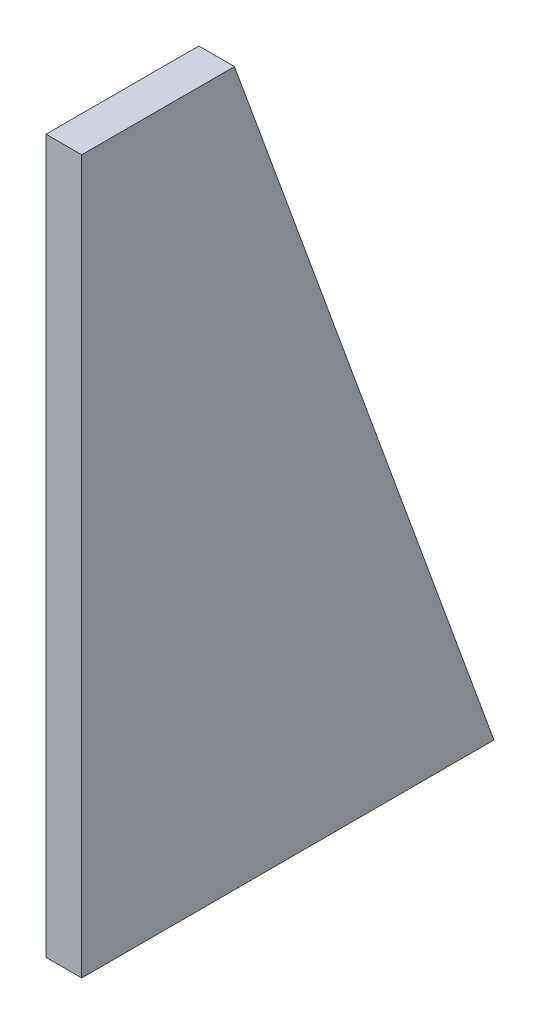
ISO-10303-21;
HEADER;
FILE_DESCRIPTION(('STEP AP214'),'2;1');
FILE_NAME('part.step','',(''),(''),'','','');
FILE_SCHEMA(('AUTOMOTIVE_DESIGN { 1 0 10303 214 1 1 1 1 }'));
ENDSEC;
DATA;
#1=APPLICATION_CONTEXT('core data for automotive mechanical design processes');
#2=APPLICATION_PROTOCOL_DEFINITION('international standard','automotive_design',2000,#1);
#3=PRODUCT_CONTEXT('',#1,'mechanical');
#4=PRODUCT('Part','Part','',(#3));
#5=PRODUCT_RELATED_PRODUCT_CATEGORY('part','',(#4));
#6=PRODUCT_DEFINITION_FORMATION('','',#4);
#7=PRODUCT_DEFINITION_CONTEXT('part definition',#1,'design');
#8=PRODUCT_DEFINITION('design','',#6,#7);
#9=PRODUCT_DEFINITION_SHAPE('','',#8);
#10=(LENGTH_UNIT() NAMED_UNIT(*) SI_UNIT(.MILLI.,.METRE.));
#11=(NAMED_UNIT(*) PLANE_ANGLE_UNIT() SI_UNIT($,.RADIAN.));
#12=(NAMED_UNIT(*) SI_UNIT($,.STERADIAN.) SOLID_ANGLE_UNIT());
#13=UNCERTAINTY_MEASURE_WITH_UNIT(LENGTH_MEASURE(1.E-05),#10,'distance_accuracy_value','');
#14=(GEOMETRIC_REPRESENTATION_CONTEXT(3) GLOBAL_UNCERTAINTY_ASSIGNED_CONTEXT((#13)) GLOBAL_UNIT_ASSIGNED_CONTEXT((#10,
#11,#12)) REPRESENTATION_CONTEXT('',''));
#15=CARTESIAN_POINT('',(0.,0.,0.));
#16=DIRECTION('',(0.,0.,1.));
#17=DIRECTION('',(1.,0.,0.));
#18=AXIS2_PLACEMENT_3D('',#15,#16,#17);
#19=CARTESIAN_POINT('',(10.,-50.,50.));
#20=DIRECTION('',(0.,1.,0.));
#21=DIRECTION('',(0.,0.,1.));
#22=AXIS2_PLACEMENT_3D('',#19,#20,#21);
#23=PLANE('',#22);
#24=DIRECTION('',(-1.,0.,0.));
#25=VECTOR('',#24,1.);
#26=CARTESIAN_POINT('',(10.,-50.,50.));
#27=LINE('',#26,#25);
#28=CARTESIAN_POINT('',(10.,-50.,50.));
#29=VERTEX_POINT('',#28);
#30=CARTESIAN_POINT('',(5.,-50.,50.));
#31=VERTEX_POINT('',#30);
#32=EDGE_CURVE('E47',#29,#31,#27,.T.);
#33=ORIENTED_EDGE('',*,*,#32,.T.);
#34=DIRECTION('',(0.,0.,1.));
#35=VECTOR('',#34,1.);
#36=CARTESIAN_POINT('',(5.,-50.,50.));
#37=LINE('',#36,#35);
#38=CARTESIAN_POINT('',(5.,-50.,-7.82088886237959));
#39=VERTEX_POINT('',#38);
#40=EDGE_CURVE('E221',#39,#31,#37,.T.);
#41=ORIENTED_EDGE('',*,*,#40,.F.);
#42=DIRECTION('',(-1.,0.,0.));
#43=VECTOR('',#42,1.);
#44=CARTESIAN_POINT('',(10.,-50.,-7.82088886237959));
#45=LINE('',#44,#43);
#46=CARTESIAN_POINT('',(10.,-50.,-7.82088886237959));
#47=VERTEX_POINT('',#46);
#48=EDGE_CURVE('E232',#47,#39,#45,.T.);
#49=ORIENTED_EDGE('',*,*,#48,.F.);
#50=DIRECTION('',(0.,0.,-1.));
#51=VECTOR('',#50,1.);
#52=CARTESIAN_POINT('',(10.,-50.,50.));
#53=LINE('',#52,#51);
#54=EDGE_CURVE('E248',#29,#47,#53,.T.);
#55=ORIENTED_EDGE('',*,*,#54,.F.);
#56=EDGE_LOOP('',(#33,#41,#49,#55));
#57=FACE_BOUND('',#56,.T.);
#58=DIRECTION('',(0.,0.,1.));
#59=VECTOR('',#58,1.);
#60=CARTESIAN_POINT('',(9.,-50.,0.));
#61=LINE('',#60,#59);
#62=CARTESIAN_POINT('',(9.,-50.,46.));
#63=VERTEX_POINT('',#62);
#64=CARTESIAN_POINT('',(9.,-50.,49.));
#65=VERTEX_POINT('',#64);
#66=EDGE_CURVE('E198',#63,#65,#61,.T.);
#67=ORIENTED_EDGE('',*,*,#66,.F.);
#68=DIRECTION('',(1.,0.,0.));
#69=VECTOR('',#68,1.);
#70=CARTESIAN_POINT('',(0.,-50.,46.));
#71=LINE('',#70,#69);
#72=CARTESIAN_POINT('',(6.,-50.,46.));
#73=VERTEX_POINT('',#72);
#74=EDGE_CURVE('E62',#73,#63,#71,.T.);
#75=ORIENTED_EDGE('',*,*,#74,.F.);
#76=DIRECTION('',(0.,0.,1.));
#77=VECTOR('',#76,1.);
#78=CARTESIAN_POINT('',(6.,-50.,0.));
#79=LINE('',#78,#77);
#80=CARTESIAN_POINT('',(6.,-50.,49.));
#81=VERTEX_POINT('',#80);
#82=EDGE_CURVE('E185',#73,#81,#79,.T.);
#83=ORIENTED_EDGE('',*,*,#82,.T.);
#84=DIRECTION('',(1.,0.,0.));
#85=VECTOR('',#84,1.);
#86=CARTESIAN_POINT('',(0.,-50.,49.));
#87=LINE('',#86,#85);
#88=EDGE_CURVE('E202',#81,#65,#87,.T.);
#89=ORIENTED_EDGE('',*,*,#88,.T.);
#90=EDGE_LOOP('',(#67,#75,#83,#89));
#91=FACE_BOUND('',#90,.T.);
#92=DIRECTION('',(1.,0.,0.));
#93=VECTOR('',#92,1.);
#94=CARTESIAN_POINT('',(0.,-50.,4.00000000000001));
#95=LINE('',#94,#93);
#96=CARTESIAN_POINT('',(6.,-50.,4.00000000000001));
#97=VERTEX_POINT('',#96);
#98=CARTESIAN_POINT('',(9.,-50.,4.00000000000001));
#99=VERTEX_POINT('',#98);
#100=EDGE_CURVE('E54',#97,#99,#95,.T.);
#101=ORIENTED_EDGE('',*,*,#100,.T.);
#102=DIRECTION('',(0.,0.,-1.));
#103=VECTOR('',#102,1.);
#104=CARTESIAN_POINT('',(9.,-50.,0.));
#105=LINE('',#104,#103);
#106=CARTESIAN_POINT('',(9.,-50.,1.00000000000001));
#107=VERTEX_POINT('',#106);
#108=EDGE_CURVE('E146',#99,#107,#105,.T.);
#109=ORIENTED_EDGE('',*,*,#108,.T.);
#110=DIRECTION('',(1.,0.,0.));
#111=VECTOR('',#110,1.);
#112=CARTESIAN_POINT('',(0.,-50.,1.00000000000001));
#113=LINE('',#112,#111);
#114=CARTESIAN_POINT('',(6.,-50.,1.00000000000001));
#115=VERTEX_POINT('',#114);
#116=EDGE_CURVE('E164',#115,#107,#113,.T.);
#117=ORIENTED_EDGE('',*,*,#116,.F.);
#118=DIRECTION('',(0.,0.,-1.));
#119=VECTOR('',#118,1.);
#120=CARTESIAN_POINT('',(6.,-50.,0.));
#121=LINE('',#120,#119);
#122=EDGE_CURVE('E160',#97,#115,#121,.T.);
#123=ORIENTED_EDGE('',*,*,#122,.F.);
#124=EDGE_LOOP('',(#101,#109,#117,#123));
#125=FACE_BOUND('',#124,.T.);
#126=ADVANCED_FACE('F38',(#57,#91,#125),#23,.F.);
#127=CARTESIAN_POINT('',(10.,50.,50.));
#128=DIRECTION('',(0.,-1.,0.));
#129=DIRECTION('',(0.,0.,-1.));
#130=AXIS2_PLACEMENT_3D('',#127,#128,#129);
#131=PLANE('',#130);
#132=DIRECTION('',(-1.,0.,0.));
#133=VECTOR('',#132,1.);
#134=CARTESIAN_POINT('',(10.,50.,28.5761345642411));
#135=LINE('',#134,#133);
#136=CARTESIAN_POINT('',(10.,50.,28.5761345642411));
#137=VERTEX_POINT('',#136);
#138=CARTESIAN_POINT('',(5.,50.,28.5761345642411));
#139=VERTEX_POINT('',#138);
#140=EDGE_CURVE('E231',#137,#139,#135,.T.);
#141=ORIENTED_EDGE('',*,*,#140,.T.);
#142=DIRECTION('',(0.,0.,-1.));
#143=VECTOR('',#142,1.);
#144=CARTESIAN_POINT('',(5.,50.,0.));
#145=LINE('',#144,#143);
#146=CARTESIAN_POINT('',(5.,50.,50.));
#147=VERTEX_POINT('',#146);
#148=EDGE_CURVE('E236',#147,#139,#145,.T.);
#149=ORIENTED_EDGE('',*,*,#148,.F.);
#150=DIRECTION('',(-1.,0.,0.));
#151=VECTOR('',#150,1.);
#152=CARTESIAN_POINT('',(10.,50.,50.));
#153=LINE('',#152,#151);
#154=CARTESIAN_POINT('',(10.,50.,50.));
#155=VERTEX_POINT('',#154);
#156=EDGE_CURVE('E11',#155,#147,#153,.T.);
#157=ORIENTED_EDGE('',*,*,#156,.F.);
#158=DIRECTION('',(0.,0.,1.));
#159=VECTOR('',#158,1.);
#160=CARTESIAN_POINT('',(10.,50.,50.));
#161=LINE('',#160,#159);
#162=EDGE_CURVE('E242',#137,#155,#161,.T.);
#163=ORIENTED_EDGE('',*,*,#162,.F.);
#164=EDGE_LOOP('',(#141,#149,#157,#163));
#165=FACE_BOUND('',#164,.T.);
#166=ADVANCED_FACE('F40',(#165),#131,.F.);
#167=CARTESIAN_POINT('',(10.,0.,0.));
#168=DIRECTION('',(1.,0.,0.));
#169=DIRECTION('',(0.,0.,-1.));
#170=AXIS2_PLACEMENT_3D('',#167,#168,#169);
#171=PLANE('',#170);
#172=ORIENTED_EDGE('',*,*,#54,.T.);
#173=DIRECTION('',(0.,-0.939692620785907,-0.342020143325673));
#174=VECTOR('',#173,1.);
#175=CARTESIAN_POINT('',(10.,-3.33530369328915,9.1636715843354));
#176=LINE('',#175,#174);
#177=EDGE_CURVE('E228',#137,#47,#176,.T.);
#178=ORIENTED_EDGE('',*,*,#177,.F.);
#179=ORIENTED_EDGE('',*,*,#162,.T.);
#180=DIRECTION('',(0.,-1.,0.));
#181=VECTOR('',#180,1.);
#182=CARTESIAN_POINT('',(10.,50.,50.));
#183=LINE('',#182,#181);
#184=EDGE_CURVE('E245',#155,#29,#183,.T.);
#185=ORIENTED_EDGE('',*,*,#184,.T.);
#186=EDGE_LOOP('',(#172,#178,#179,#185));
#187=FACE_BOUND('',#186,.T.);
#188=ADVANCED_FACE('F273',(#187),#171,.T.);
#189=CARTESIAN_POINT('',(10.,50.,50.));
#190=DIRECTION('',(0.,0.,-1.));
#191=DIRECTION('',(0.,1.,0.));
#192=AXIS2_PLACEMENT_3D('',#189,#190,#191);
#193=PLANE('',#192);
#194=ORIENTED_EDGE('',*,*,#156,.T.);
#195=DIRECTION('',(0.,1.,0.));
#196=VECTOR('',#195,1.);
#197=CARTESIAN_POINT('',(5.,50.,50.));
#198=LINE('',#197,#196);
#199=EDGE_CURVE('E224',#31,#147,#198,.T.);
#200=ORIENTED_EDGE('',*,*,#199,.F.);
#201=ORIENTED_EDGE('',*,*,#32,.F.);
#202=ORIENTED_EDGE('',*,*,#184,.F.);
#203=EDGE_LOOP('',(#194,#200,#201,#202));
#204=FACE_BOUND('',#203,.T.);
#205=ADVANCED_FACE('F262',(#204),#193,.F.);
#206=CARTESIAN_POINT('',(5.,0.,0.));
#207=DIRECTION('',(-1.,0.,0.));
#208=DIRECTION('',(0.,0.,1.));
#209=AXIS2_PLACEMENT_3D('',#206,#207,#208);
#210=PLANE('',#209);
#211=ORIENTED_EDGE('',*,*,#148,.T.);
#212=DIRECTION('',(0.,-0.939692620785907,-0.342020143325672));
#213=VECTOR('',#212,1.);
#214=CARTESIAN_POINT('',(5.,-50.,-7.82088886237959));
#215=LINE('',#214,#213);
#216=EDGE_CURVE('E174',#139,#39,#215,.T.);
#217=ORIENTED_EDGE('',*,*,#216,.T.);
#218=ORIENTED_EDGE('',*,*,#40,.T.);
#219=ORIENTED_EDGE('',*,*,#199,.T.);
#220=EDGE_LOOP('',(#211,#217,#218,#219));
#221=FACE_BOUND('',#220,.T.);
#222=ADVANCED_FACE('F265',(#221),#210,.T.);
#223=CARTESIAN_POINT('',(10.,-3.33530369328915,9.1636715843354));
#224=DIRECTION('',(0.,0.342020143325673,-0.939692620785907));
#225=DIRECTION('',(0.,0.939692620785907,0.342020143325673));
#226=AXIS2_PLACEMENT_3D('',#223,#224,#225);
#227=PLANE('',#226);
#228=ORIENTED_EDGE('',*,*,#216,.F.);
#229=ORIENTED_EDGE('',*,*,#140,.F.);
#230=ORIENTED_EDGE('',*,*,#177,.T.);
#231=ORIENTED_EDGE('',*,*,#48,.T.);
#232=EDGE_LOOP('',(#228,#229,#230,#231));
#233=FACE_BOUND('',#232,.T.);
#234=ADVANCED_FACE('F268',(#233),#227,.T.);
#235=CARTESIAN_POINT('',(0.,-45.,46.));
#236=DIRECTION('',(0.,0.,-1.));
#237=DIRECTION('',(-1.,0.,0.));
#238=AXIS2_PLACEMENT_3D('',#235,#236,#237);
#239=PLANE('',#238);
#240=ORIENTED_EDGE('',*,*,#74,.T.);
#241=DIRECTION('',(0.,-1.,0.));
#242=VECTOR('',#241,1.);
#243=CARTESIAN_POINT('',(9.,-45.,46.));
#244=LINE('',#243,#242);
#245=CARTESIAN_POINT('',(9.,-45.,46.));
#246=VERTEX_POINT('',#245);
#247=EDGE_CURVE('E195',#246,#63,#244,.T.);
#248=ORIENTED_EDGE('',*,*,#247,.F.);
#249=DIRECTION('',(1.,0.,0.));
#250=VECTOR('',#249,1.);
#251=CARTESIAN_POINT('',(0.,-45.,46.));
#252=LINE('',#251,#250);
#253=CARTESIAN_POINT('',(6.,-45.,46.));
#254=VERTEX_POINT('',#253);
#255=EDGE_CURVE('E180',#254,#246,#252,.T.);
#256=ORIENTED_EDGE('',*,*,#255,.F.);
#257=DIRECTION('',(0.,-1.,0.));
#258=VECTOR('',#257,1.);
#259=CARTESIAN_POINT('',(6.,-45.,46.));
#260=LINE('',#259,#258);
#261=EDGE_CURVE('E161',#254,#73,#260,.T.);
#262=ORIENTED_EDGE('',*,*,#261,.T.);
#263=EDGE_LOOP('',(#240,#248,#256,#262));
#264=FACE_BOUND('',#263,.T.);
#265=ADVANCED_FACE('F315',(#264),#239,.F.);
#266=CARTESIAN_POINT('',(6.,-45.,0.));
#267=DIRECTION('',(1.,0.,0.));
#268=DIRECTION('',(0.,0.,-1.));
#269=AXIS2_PLACEMENT_3D('',#266,#267,#268);
#270=PLANE('',#269);
#271=ORIENTED_EDGE('',*,*,#82,.F.);
#272=ORIENTED_EDGE('',*,*,#261,.F.);
#273=DIRECTION('',(0.,0.,1.));
#274=VECTOR('',#273,1.);
#275=CARTESIAN_POINT('',(6.,-45.,0.));
#276=LINE('',#275,#274);
#277=CARTESIAN_POINT('',(6.,-45.,49.));
#278=VERTEX_POINT('',#277);
#279=EDGE_CURVE('E192',#254,#278,#276,.T.);
#280=ORIENTED_EDGE('',*,*,#279,.T.);
#281=DIRECTION('',(0.,-1.,0.));
#282=VECTOR('',#281,1.);
#283=CARTESIAN_POINT('',(6.,-45.,49.));
#284=LINE('',#283,#282);
#285=EDGE_CURVE('E211',#278,#81,#284,.T.);
#286=ORIENTED_EDGE('',*,*,#285,.T.);
#287=EDGE_LOOP('',(#271,#272,#280,#286));
#288=FACE_BOUND('',#287,.T.);
#289=ADVANCED_FACE('F324',(#288),#270,.T.);
#290=CARTESIAN_POINT('',(0.,-45.,49.));
#291=DIRECTION('',(0.,0.,-1.));
#292=DIRECTION('',(-1.,0.,0.));
#293=AXIS2_PLACEMENT_3D('',#290,#291,#292);
#294=PLANE('',#293);
#295=ORIENTED_EDGE('',*,*,#88,.F.);
#296=ORIENTED_EDGE('',*,*,#285,.F.);
#297=DIRECTION('',(1.,0.,0.));
#298=VECTOR('',#297,1.);
#299=CARTESIAN_POINT('',(0.,-45.,49.));
#300=LINE('',#299,#298);
#301=CARTESIAN_POINT('',(9.,-45.,49.));
#302=VERTEX_POINT('',#301);
#303=EDGE_CURVE('E189',#278,#302,#300,.T.);
#304=ORIENTED_EDGE('',*,*,#303,.T.);
#305=DIRECTION('',(0.,-1.,0.));
#306=VECTOR('',#305,1.);
#307=CARTESIAN_POINT('',(9.,-45.,49.));
#308=LINE('',#307,#306);
#309=EDGE_CURVE('E214',#302,#65,#308,.T.);
#310=ORIENTED_EDGE('',*,*,#309,.T.);
#311=EDGE_LOOP('',(#295,#296,#304,#310));
#312=FACE_BOUND('',#311,.T.);
#313=ADVANCED_FACE('F331',(#312),#294,.T.);
#314=CARTESIAN_POINT('',(9.,-45.,0.));
#315=DIRECTION('',(1.,0.,0.));
#316=DIRECTION('',(0.,0.,-1.));
#317=AXIS2_PLACEMENT_3D('',#314,#315,#316);
#318=PLANE('',#317);
#319=ORIENTED_EDGE('',*,*,#66,.T.);
#320=ORIENTED_EDGE('',*,*,#309,.F.);
#321=DIRECTION('',(0.,0.,1.));
#322=VECTOR('',#321,1.);
#323=CARTESIAN_POINT('',(9.,-45.,0.));
#324=LINE('',#323,#322);
#325=EDGE_CURVE('E184',#246,#302,#324,.T.);
#326=ORIENTED_EDGE('',*,*,#325,.F.);
#327=ORIENTED_EDGE('',*,*,#247,.T.);
#328=EDGE_LOOP('',(#319,#320,#326,#327));
#329=FACE_BOUND('',#328,.T.);
#330=ADVANCED_FACE('F339',(#329),#318,.F.);
#331=CARTESIAN_POINT('',(0.,-45.,0.));
#332=DIRECTION('',(0.,-1.,0.));
#333=DIRECTION('',(0.,0.,-1.));
#334=AXIS2_PLACEMENT_3D('',#331,#332,#333);
#335=PLANE('',#334);
#336=ORIENTED_EDGE('',*,*,#255,.T.);
#337=ORIENTED_EDGE('',*,*,#325,.T.);
#338=ORIENTED_EDGE('',*,*,#303,.F.);
#339=ORIENTED_EDGE('',*,*,#279,.F.);
#340=EDGE_LOOP('',(#336,#337,#338,#339));
#341=FACE_BOUND('',#340,.T.);
#342=ADVANCED_FACE('F347',(#341),#335,.T.);
#343=CARTESIAN_POINT('',(0.,-45.,4.00000000000001));
#344=DIRECTION('',(0.,0.,-1.));
#345=DIRECTION('',(-1.,0.,0.));
#346=AXIS2_PLACEMENT_3D('',#343,#344,#345);
#347=PLANE('',#346);
#348=ORIENTED_EDGE('',*,*,#100,.F.);
#349=DIRECTION('',(0.,-1.,0.));
#350=VECTOR('',#349,1.);
#351=CARTESIAN_POINT('',(6.,-45.,4.00000000000001));
#352=LINE('',#351,#350);
#353=CARTESIAN_POINT('',(6.,-45.,4.00000000000001));
#354=VERTEX_POINT('',#353);
#355=EDGE_CURVE('E127',#354,#97,#352,.T.);
#356=ORIENTED_EDGE('',*,*,#355,.F.);
#357=DIRECTION('',(1.,0.,0.));
#358=VECTOR('',#357,1.);
#359=CARTESIAN_POINT('',(0.,-45.,4.00000000000001));
#360=LINE('',#359,#358);
#361=CARTESIAN_POINT('',(9.,-45.,4.00000000000001));
#362=VERTEX_POINT('',#361);
#363=EDGE_CURVE('E130',#354,#362,#360,.T.);
#364=ORIENTED_EDGE('',*,*,#363,.T.);
#365=DIRECTION('',(0.,-1.,0.));
#366=VECTOR('',#365,1.);
#367=CARTESIAN_POINT('',(9.,-45.,4.00000000000001));
#368=LINE('',#367,#366);
#369=EDGE_CURVE('E171',#362,#99,#368,.T.);
#370=ORIENTED_EDGE('',*,*,#369,.T.);
#371=EDGE_LOOP('',(#348,#356,#364,#370));
#372=FACE_BOUND('',#371,.T.);
#373=ADVANCED_FACE('F129',(#372),#347,.T.);
#374=CARTESIAN_POINT('',(9.,-45.,0.));
#375=DIRECTION('',(-1.,0.,0.));
#376=DIRECTION('',(0.,0.,1.));
#377=AXIS2_PLACEMENT_3D('',#374,#375,#376);
#378=PLANE('',#377);
#379=ORIENTED_EDGE('',*,*,#108,.F.);
#380=ORIENTED_EDGE('',*,*,#369,.F.);
#381=DIRECTION('',(0.,0.,-1.));
#382=VECTOR('',#381,1.);
#383=CARTESIAN_POINT('',(9.,-45.,0.));
#384=LINE('',#383,#382);
#385=CARTESIAN_POINT('',(9.,-45.,1.00000000000001));
#386=VERTEX_POINT('',#385);
#387=EDGE_CURVE('E138',#362,#386,#384,.T.);
#388=ORIENTED_EDGE('',*,*,#387,.T.);
#389=DIRECTION('',(0.,-1.,0.));
#390=VECTOR('',#389,1.);
#391=CARTESIAN_POINT('',(9.,-45.,1.00000000000001));
#392=LINE('',#391,#390);
#393=EDGE_CURVE('E175',#386,#107,#392,.T.);
#394=ORIENTED_EDGE('',*,*,#393,.T.);
#395=EDGE_LOOP('',(#379,#380,#388,#394));
#396=FACE_BOUND('',#395,.T.);
#397=ADVANCED_FACE('F362',(#396),#378,.T.);
#398=CARTESIAN_POINT('',(0.,-45.,1.00000000000001));
#399=DIRECTION('',(0.,0.,-1.));
#400=DIRECTION('',(-1.,0.,0.));
#401=AXIS2_PLACEMENT_3D('',#398,#399,#400);
#402=PLANE('',#401);
#403=ORIENTED_EDGE('',*,*,#116,.T.);
#404=ORIENTED_EDGE('',*,*,#393,.F.);
#405=DIRECTION('',(1.,0.,0.));
#406=VECTOR('',#405,1.);
#407=CARTESIAN_POINT('',(0.,-45.,1.00000000000001));
#408=LINE('',#407,#406);
#409=CARTESIAN_POINT('',(6.,-45.,1.00000000000001));
#410=VERTEX_POINT('',#409);
#411=EDGE_CURVE('E151',#410,#386,#408,.T.);
#412=ORIENTED_EDGE('',*,*,#411,.F.);
#413=DIRECTION('',(0.,-1.,0.));
#414=VECTOR('',#413,1.);
#415=CARTESIAN_POINT('',(6.,-45.,1.00000000000001));
#416=LINE('',#415,#414);
#417=EDGE_CURVE('E137',#410,#115,#416,.T.);
#418=ORIENTED_EDGE('',*,*,#417,.T.);
#419=EDGE_LOOP('',(#403,#404,#412,#418));
#420=FACE_BOUND('',#419,.T.);
#421=ADVANCED_FACE('F369',(#420),#402,.F.);
#422=CARTESIAN_POINT('',(6.,-45.,0.));
#423=DIRECTION('',(-1.,0.,0.));
#424=DIRECTION('',(0.,0.,1.));
#425=AXIS2_PLACEMENT_3D('',#422,#423,#424);
#426=PLANE('',#425);
#427=ORIENTED_EDGE('',*,*,#122,.T.);
#428=ORIENTED_EDGE('',*,*,#417,.F.);
#429=DIRECTION('',(0.,0.,-1.));
#430=VECTOR('',#429,1.);
#431=CARTESIAN_POINT('',(6.,-45.,0.));
#432=LINE('',#431,#430);
#433=EDGE_CURVE('E144',#354,#410,#432,.T.);
#434=ORIENTED_EDGE('',*,*,#433,.F.);
#435=ORIENTED_EDGE('',*,*,#355,.T.);
#436=EDGE_LOOP('',(#427,#428,#434,#435));
#437=FACE_BOUND('',#436,.T.);
#438=ADVANCED_FACE('F148',(#437),#426,.F.);
#439=CARTESIAN_POINT('',(0.,-45.,0.));
#440=DIRECTION('',(0.,-1.,0.));
#441=DIRECTION('',(0.,0.,-1.));
#442=AXIS2_PLACEMENT_3D('',#439,#440,#441);
#443=PLANE('',#442);
#444=ORIENTED_EDGE('',*,*,#363,.F.);
#445=ORIENTED_EDGE('',*,*,#433,.T.);
#446=ORIENTED_EDGE('',*,*,#411,.T.);
#447=ORIENTED_EDGE('',*,*,#387,.F.);
#448=EDGE_LOOP('',(#444,#445,#446,#447));
#449=FACE_BOUND('',#448,.T.);
#450=ADVANCED_FACE('F142',(#449),#443,.T.);
#451=CLOSED_SHELL('',(#126,#166,#188,#205,#222,#234,#265,#289,#313,#330,#342,#373,#397,#421,
#438,#450));
#452=MANIFOLD_SOLID_BREP('B2',#451);
#453=ADVANCED_BREP_SHAPE_REPRESENTATION('',(#18,#452),#14);
#454=SHAPE_DEFINITION_REPRESENTATION(#9,#453);
ENDSEC;
END-ISO-10303-21;
